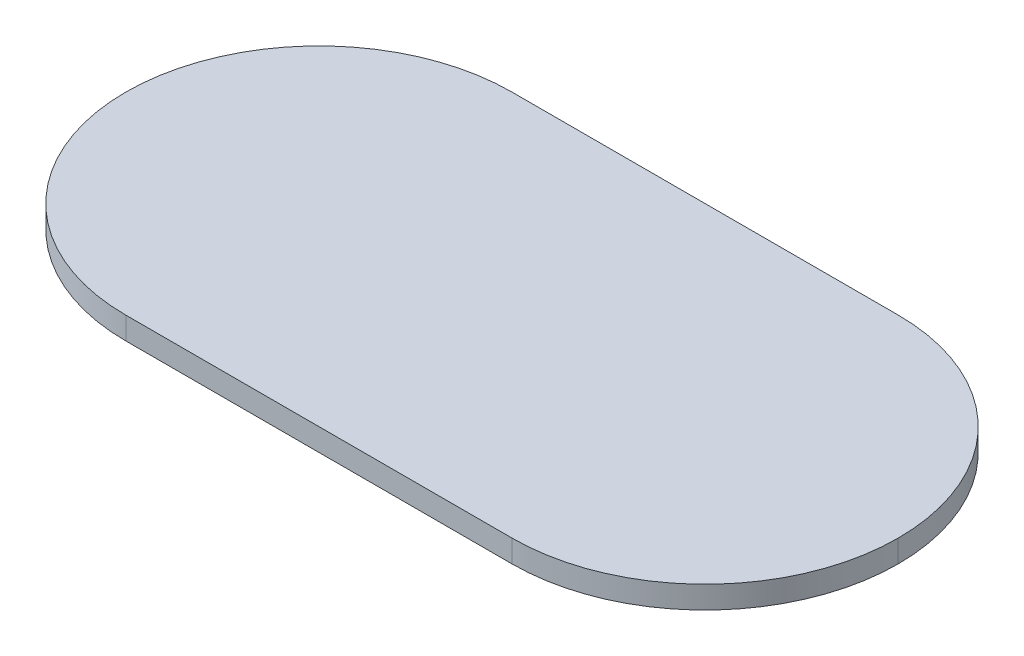
ISO-10303-21;
HEADER;
FILE_DESCRIPTION(('STEP AP214'),'2;1');
FILE_NAME('part.step','',(''),(''),'','','');
FILE_SCHEMA(('AUTOMOTIVE_DESIGN { 1 0 10303 214 1 1 1 1 }'));
ENDSEC;
DATA;
#1=APPLICATION_CONTEXT('core data for automotive mechanical design processes');
#2=APPLICATION_PROTOCOL_DEFINITION('international standard','automotive_design',2000,#1);
#3=PRODUCT_CONTEXT('',#1,'mechanical');
#4=PRODUCT('Part','Part','',(#3));
#5=PRODUCT_RELATED_PRODUCT_CATEGORY('part','',(#4));
#6=PRODUCT_DEFINITION_FORMATION('','',#4);
#7=PRODUCT_DEFINITION_CONTEXT('part definition',#1,'design');
#8=PRODUCT_DEFINITION('design','',#6,#7);
#9=PRODUCT_DEFINITION_SHAPE('','',#8);
#10=(LENGTH_UNIT() NAMED_UNIT(*) SI_UNIT(.MILLI.,.METRE.));
#11=(NAMED_UNIT(*) PLANE_ANGLE_UNIT() SI_UNIT($,.RADIAN.));
#12=(NAMED_UNIT(*) SI_UNIT($,.STERADIAN.) SOLID_ANGLE_UNIT());
#13=UNCERTAINTY_MEASURE_WITH_UNIT(LENGTH_MEASURE(1.E-05),#10,'distance_accuracy_value','');
#14=(GEOMETRIC_REPRESENTATION_CONTEXT(3) GLOBAL_UNCERTAINTY_ASSIGNED_CONTEXT((#13)) GLOBAL_UNIT_ASSIGNED_CONTEXT((#10,
#11,#12)) REPRESENTATION_CONTEXT('',''));
#15=CARTESIAN_POINT('',(0.,0.,0.));
#16=DIRECTION('',(0.,0.,1.));
#17=DIRECTION('',(1.,0.,0.));
#18=AXIS2_PLACEMENT_3D('',#15,#16,#17);
#19=CARTESIAN_POINT('',(-69.,4.,-34.5));
#20=DIRECTION('',(0.,0.,1.));
#21=DIRECTION('',(1.,0.,0.));
#22=AXIS2_PLACEMENT_3D('',#19,#20,#21);
#23=PLANE('',#22);
#24=DIRECTION('',(-1.,0.,0.));
#25=VECTOR('',#24,1.);
#26=CARTESIAN_POINT('',(-69.,4.,-34.5));
#27=LINE('',#26,#25);
#28=CARTESIAN_POINT('',(34.5,4.,-34.5));
#29=VERTEX_POINT('',#28);
#30=CARTESIAN_POINT('',(-34.5,4.,-34.5));
#31=VERTEX_POINT('',#30);
#32=EDGE_CURVE('E124',#29,#31,#27,.T.);
#33=ORIENTED_EDGE('',*,*,#32,.F.);
#34=DIRECTION('',(0.,-1.,0.));
#35=VECTOR('',#34,1.);
#36=CARTESIAN_POINT('',(34.5,4.,-34.5));
#37=LINE('',#36,#35);
#38=CARTESIAN_POINT('',(34.5,0.,-34.5));
#39=VERTEX_POINT('',#38);
#40=EDGE_CURVE('E11',#29,#39,#37,.T.);
#41=ORIENTED_EDGE('',*,*,#40,.T.);
#42=DIRECTION('',(-1.,0.,0.));
#43=VECTOR('',#42,1.);
#44=CARTESIAN_POINT('',(-69.,0.,-34.5));
#45=LINE('',#44,#43);
#46=CARTESIAN_POINT('',(-34.5,0.,-34.5));
#47=VERTEX_POINT('',#46);
#48=EDGE_CURVE('E95',#39,#47,#45,.T.);
#49=ORIENTED_EDGE('',*,*,#48,.T.);
#50=DIRECTION('',(0.,-1.,0.));
#51=VECTOR('',#50,1.);
#52=CARTESIAN_POINT('',(-34.5,4.,-34.5));
#53=LINE('',#52,#51);
#54=EDGE_CURVE('E42',#47,#31,#53,.F.);
#55=ORIENTED_EDGE('',*,*,#54,.T.);
#56=EDGE_LOOP('',(#33,#41,#49,#55));
#57=FACE_BOUND('',#56,.T.);
#58=ADVANCED_FACE('F33',(#57),#23,.F.);
#59=CARTESIAN_POINT('',(-69.,4.,34.5));
#60=DIRECTION('',(0.,0.,-1.));
#61=DIRECTION('',(-1.,0.,0.));
#62=AXIS2_PLACEMENT_3D('',#59,#60,#61);
#63=PLANE('',#62);
#64=DIRECTION('',(1.,0.,0.));
#65=VECTOR('',#64,1.);
#66=CARTESIAN_POINT('',(-69.,0.,34.5));
#67=LINE('',#66,#65);
#68=CARTESIAN_POINT('',(-34.5,0.,34.5));
#69=VERTEX_POINT('',#68);
#70=CARTESIAN_POINT('',(34.5,0.,34.5));
#71=VERTEX_POINT('',#70);
#72=EDGE_CURVE('E129',#69,#71,#67,.T.);
#73=ORIENTED_EDGE('',*,*,#72,.T.);
#74=DIRECTION('',(0.,-1.,0.));
#75=VECTOR('',#74,1.);
#76=CARTESIAN_POINT('',(34.5,4.,34.5));
#77=LINE('',#76,#75);
#78=CARTESIAN_POINT('',(34.5,4.,34.5));
#79=VERTEX_POINT('',#78);
#80=EDGE_CURVE('E109',#71,#79,#77,.F.);
#81=ORIENTED_EDGE('',*,*,#80,.T.);
#82=DIRECTION('',(1.,0.,0.));
#83=VECTOR('',#82,1.);
#84=CARTESIAN_POINT('',(-69.,4.,34.5));
#85=LINE('',#84,#83);
#86=CARTESIAN_POINT('',(-34.5,4.,34.5));
#87=VERTEX_POINT('',#86);
#88=EDGE_CURVE('E128',#87,#79,#85,.T.);
#89=ORIENTED_EDGE('',*,*,#88,.F.);
#90=DIRECTION('',(0.,-1.,0.));
#91=VECTOR('',#90,1.);
#92=CARTESIAN_POINT('',(-34.5,4.,34.5));
#93=LINE('',#92,#91);
#94=EDGE_CURVE('E110',#87,#69,#93,.T.);
#95=ORIENTED_EDGE('',*,*,#94,.T.);
#96=EDGE_LOOP('',(#73,#81,#89,#95));
#97=FACE_BOUND('',#96,.T.);
#98=ADVANCED_FACE('F143',(#97),#63,.F.);
#99=CARTESIAN_POINT('',(0.,4.,0.));
#100=DIRECTION('',(0.,-1.,0.));
#101=DIRECTION('',(0.,0.,-1.));
#102=AXIS2_PLACEMENT_3D('',#99,#100,#101);
#103=PLANE('',#102);
#104=ORIENTED_EDGE('',*,*,#88,.T.);
#105=CARTESIAN_POINT('',(34.5,4.,0.));
#106=DIRECTION('',(0.,-1.,0.));
#107=DIRECTION('',(0.,0.,-1.));
#108=AXIS2_PLACEMENT_3D('',#105,#106,#107);
#109=CIRCLE('',#108,34.5);
#110=CARTESIAN_POINT('',(69.,4.,0.));
#111=VERTEX_POINT('',#110);
#112=EDGE_CURVE('E120',#79,#111,#109,.F.);
#113=ORIENTED_EDGE('',*,*,#112,.T.);
#114=CARTESIAN_POINT('',(34.5,4.,0.));
#115=DIRECTION('',(0.,-1.,0.));
#116=DIRECTION('',(0.,0.,-1.));
#117=AXIS2_PLACEMENT_3D('',#114,#115,#116);
#118=CIRCLE('',#117,34.5);
#119=EDGE_CURVE('E104',#111,#29,#118,.F.);
#120=ORIENTED_EDGE('',*,*,#119,.T.);
#121=ORIENTED_EDGE('',*,*,#32,.T.);
#122=CARTESIAN_POINT('',(-34.5,4.,0.));
#123=DIRECTION('',(0.,-1.,0.));
#124=DIRECTION('',(0.,0.,-1.));
#125=AXIS2_PLACEMENT_3D('',#122,#123,#124);
#126=CIRCLE('',#125,34.5);
#127=CARTESIAN_POINT('',(-69.,4.,0.));
#128=VERTEX_POINT('',#127);
#129=EDGE_CURVE('E50',#31,#128,#126,.F.);
#130=ORIENTED_EDGE('',*,*,#129,.T.);
#131=CARTESIAN_POINT('',(-34.5,4.,0.));
#132=DIRECTION('',(0.,-1.,0.));
#133=DIRECTION('',(0.,0.,-1.));
#134=AXIS2_PLACEMENT_3D('',#131,#132,#133);
#135=CIRCLE('',#134,34.5);
#136=EDGE_CURVE('E116',#128,#87,#135,.F.);
#137=ORIENTED_EDGE('',*,*,#136,.T.);
#138=EDGE_LOOP('',(#104,#113,#120,#121,#130,#137));
#139=FACE_BOUND('',#138,.T.);
#140=ADVANCED_FACE('F127',(#139),#103,.F.);
#141=CARTESIAN_POINT('',(0.,0.,0.));
#142=DIRECTION('',(0.,-1.,0.));
#143=DIRECTION('',(0.,0.,-1.));
#144=AXIS2_PLACEMENT_3D('',#141,#142,#143);
#145=PLANE('',#144);
#146=CARTESIAN_POINT('',(34.5,0.,0.));
#147=DIRECTION('',(0.,-1.,0.));
#148=DIRECTION('',(0.,0.,-1.));
#149=AXIS2_PLACEMENT_3D('',#146,#147,#148);
#150=CIRCLE('',#149,34.5);
#151=CARTESIAN_POINT('',(69.,0.,0.));
#152=VERTEX_POINT('',#151);
#153=EDGE_CURVE('E87',#39,#152,#150,.T.);
#154=ORIENTED_EDGE('',*,*,#153,.T.);
#155=CARTESIAN_POINT('',(34.5,0.,0.));
#156=DIRECTION('',(0.,-1.,0.));
#157=DIRECTION('',(0.,0.,-1.));
#158=AXIS2_PLACEMENT_3D('',#155,#156,#157);
#159=CIRCLE('',#158,34.5);
#160=EDGE_CURVE('E92',#152,#71,#159,.T.);
#161=ORIENTED_EDGE('',*,*,#160,.T.);
#162=ORIENTED_EDGE('',*,*,#72,.F.);
#163=CARTESIAN_POINT('',(-34.5,0.,0.));
#164=DIRECTION('',(0.,-1.,0.));
#165=DIRECTION('',(0.,0.,-1.));
#166=AXIS2_PLACEMENT_3D('',#163,#164,#165);
#167=CIRCLE('',#166,34.5);
#168=CARTESIAN_POINT('',(-69.,0.,0.));
#169=VERTEX_POINT('',#168);
#170=EDGE_CURVE('E131',#69,#169,#167,.T.);
#171=ORIENTED_EDGE('',*,*,#170,.T.);
#172=CARTESIAN_POINT('',(-34.5,0.,0.));
#173=DIRECTION('',(0.,-1.,0.));
#174=DIRECTION('',(0.,0.,-1.));
#175=AXIS2_PLACEMENT_3D('',#172,#173,#174);
#176=CIRCLE('',#175,34.5);
#177=EDGE_CURVE('E98',#169,#47,#176,.T.);
#178=ORIENTED_EDGE('',*,*,#177,.T.);
#179=ORIENTED_EDGE('',*,*,#48,.F.);
#180=EDGE_LOOP('',(#154,#161,#162,#171,#178,#179));
#181=FACE_BOUND('',#180,.T.);
#182=ADVANCED_FACE('F89',(#181),#145,.T.);
#183=CARTESIAN_POINT('',(34.5,4.,0.));
#184=DIRECTION('',(0.,-1.,0.));
#185=DIRECTION('',(0.,0.,-1.));
#186=AXIS2_PLACEMENT_3D('',#183,#184,#185);
#187=CYLINDRICAL_SURFACE('',#186,34.5);
#188=ORIENTED_EDGE('',*,*,#40,.F.);
#189=ORIENTED_EDGE('',*,*,#119,.F.);
#190=DIRECTION('',(0.,-1.,0.));
#191=VECTOR('',#190,1.);
#192=CARTESIAN_POINT('',(69.,4.,0.));
#193=LINE('',#192,#191);
#194=EDGE_CURVE('E102',#152,#111,#193,.F.);
#195=ORIENTED_EDGE('',*,*,#194,.F.);
#196=ORIENTED_EDGE('',*,*,#153,.F.);
#197=EDGE_LOOP('',(#188,#189,#195,#196));
#198=FACE_BOUND('',#197,.T.);
#199=ADVANCED_FACE('F103',(#198),#187,.T.);
#200=CARTESIAN_POINT('',(34.5,4.,0.));
#201=DIRECTION('',(0.,-1.,0.));
#202=DIRECTION('',(0.,0.,-1.));
#203=AXIS2_PLACEMENT_3D('',#200,#201,#202);
#204=CYLINDRICAL_SURFACE('',#203,34.5);
#205=ORIENTED_EDGE('',*,*,#112,.F.);
#206=ORIENTED_EDGE('',*,*,#80,.F.);
#207=ORIENTED_EDGE('',*,*,#160,.F.);
#208=ORIENTED_EDGE('',*,*,#194,.T.);
#209=EDGE_LOOP('',(#205,#206,#207,#208));
#210=FACE_BOUND('',#209,.T.);
#211=ADVANCED_FACE('F107',(#210),#204,.T.);
#212=CARTESIAN_POINT('',(-34.5,4.,0.));
#213=DIRECTION('',(0.,-1.,0.));
#214=DIRECTION('',(0.,0.,-1.));
#215=AXIS2_PLACEMENT_3D('',#212,#213,#214);
#216=CYLINDRICAL_SURFACE('',#215,34.5);
#217=ORIENTED_EDGE('',*,*,#94,.F.);
#218=ORIENTED_EDGE('',*,*,#136,.F.);
#219=DIRECTION('',(0.,-1.,0.));
#220=VECTOR('',#219,1.);
#221=CARTESIAN_POINT('',(-69.,4.,0.));
#222=LINE('',#221,#220);
#223=EDGE_CURVE('E37',#169,#128,#222,.F.);
#224=ORIENTED_EDGE('',*,*,#223,.F.);
#225=ORIENTED_EDGE('',*,*,#170,.F.);
#226=EDGE_LOOP('',(#217,#218,#224,#225));
#227=FACE_BOUND('',#226,.T.);
#228=ADVANCED_FACE('F35',(#227),#216,.T.);
#229=CARTESIAN_POINT('',(-34.5,4.,0.));
#230=DIRECTION('',(0.,-1.,0.));
#231=DIRECTION('',(0.,0.,-1.));
#232=AXIS2_PLACEMENT_3D('',#229,#230,#231);
#233=CYLINDRICAL_SURFACE('',#232,34.5);
#234=ORIENTED_EDGE('',*,*,#129,.F.);
#235=ORIENTED_EDGE('',*,*,#54,.F.);
#236=ORIENTED_EDGE('',*,*,#177,.F.);
#237=ORIENTED_EDGE('',*,*,#223,.T.);
#238=EDGE_LOOP('',(#234,#235,#236,#237));
#239=FACE_BOUND('',#238,.T.);
#240=ADVANCED_FACE('F138',(#239),#233,.T.);
#241=CLOSED_SHELL('',(#58,#98,#140,#182,#199,#211,#228,#240));
#242=MANIFOLD_SOLID_BREP('B2',#241);
#243=ADVANCED_BREP_SHAPE_REPRESENTATION('',(#18,#242),#14);
#244=SHAPE_DEFINITION_REPRESENTATION(#9,#243);
ENDSEC;
END-ISO-10303-21;
